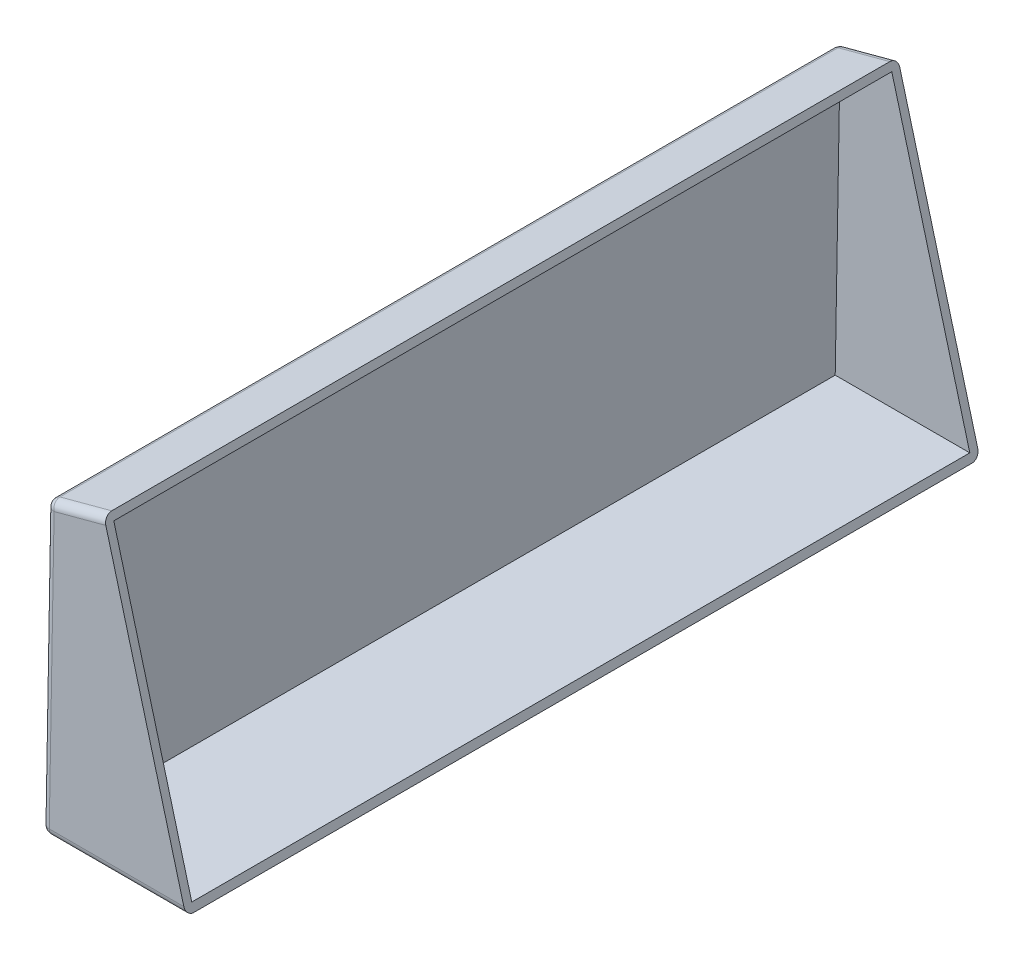
ISO-10303-21;
HEADER;
FILE_DESCRIPTION(('STEP AP214'),'2;1');
FILE_NAME('part.step','',(''),(''),'','','');
FILE_SCHEMA(('AUTOMOTIVE_DESIGN { 1 0 10303 214 1 1 1 1 }'));
ENDSEC;
DATA;
#1=APPLICATION_CONTEXT('core data for automotive mechanical design processes');
#2=APPLICATION_PROTOCOL_DEFINITION('international standard','automotive_design',2000,#1);
#3=PRODUCT_CONTEXT('',#1,'mechanical');
#4=PRODUCT('Part','Part','',(#3));
#5=PRODUCT_RELATED_PRODUCT_CATEGORY('part','',(#4));
#6=PRODUCT_DEFINITION_FORMATION('','',#4);
#7=PRODUCT_DEFINITION_CONTEXT('part definition',#1,'design');
#8=PRODUCT_DEFINITION('design','',#6,#7);
#9=PRODUCT_DEFINITION_SHAPE('','',#8);
#10=(LENGTH_UNIT() NAMED_UNIT(*) SI_UNIT(.MILLI.,.METRE.));
#11=(NAMED_UNIT(*) PLANE_ANGLE_UNIT() SI_UNIT($,.RADIAN.));
#12=(NAMED_UNIT(*) SI_UNIT($,.STERADIAN.) SOLID_ANGLE_UNIT());
#13=UNCERTAINTY_MEASURE_WITH_UNIT(LENGTH_MEASURE(1.E-05),#10,'distance_accuracy_value','');
#14=(GEOMETRIC_REPRESENTATION_CONTEXT(3) GLOBAL_UNCERTAINTY_ASSIGNED_CONTEXT((#13)) GLOBAL_UNIT_ASSIGNED_CONTEXT((#10,
#11,#12)) REPRESENTATION_CONTEXT('',''));
#15=CARTESIAN_POINT('',(0.,0.,0.));
#16=DIRECTION('',(0.,0.,1.));
#17=DIRECTION('',(1.,0.,0.));
#18=AXIS2_PLACEMENT_3D('',#15,#16,#17);
#19=CARTESIAN_POINT('',(-20.705523608202,77.2740661031254,200.));
#20=DIRECTION('',(-0.965925826289067,-0.258819045102525,0.));
#21=DIRECTION('',(0.258819045102525,-0.965925826289067,0.));
#22=AXIS2_PLACEMENT_3D('',#19,#20,#21);
#23=PLANE('',#22);
#24=DIRECTION('',(-0.258819045102525,0.965925826289067,0.));
#25=VECTOR('',#24,1.);
#26=CARTESIAN_POINT('',(-20.705523608202,77.2740661031254,0.));
#27=LINE('',#26,#25);
#28=CARTESIAN_POINT('',(-0.535898384862257,2.,0.));
#29=VERTEX_POINT('',#28);
#30=CARTESIAN_POINT('',(-20.1878855179969,75.3422144505472,0.));
#31=VERTEX_POINT('',#30);
#32=EDGE_CURVE('E179',#29,#31,#27,.T.);
#33=ORIENTED_EDGE('',*,*,#32,.T.);
#34=CARTESIAN_POINT('',(-20.187885517997,75.3422144505472,2.));
#35=DIRECTION('',(-0.965925826289067,-0.258819045102525,0.));
#36=DIRECTION('',(0.258819045102525,-0.965925826289067,0.));
#37=AXIS2_PLACEMENT_3D('',#34,#35,#36);
#38=CIRCLE('',#37,2.);
#39=CARTESIAN_POINT('',(-20.705523608202,77.2740661031254,2.));
#40=VERTEX_POINT('',#39);
#41=EDGE_CURVE('E11',#31,#40,#38,.F.);
#42=ORIENTED_EDGE('',*,*,#41,.T.);
#43=DIRECTION('',(0.,0.,-1.));
#44=VECTOR('',#43,1.);
#45=CARTESIAN_POINT('',(-20.705523608202,77.2740661031254,200.));
#46=LINE('',#45,#44);
#47=CARTESIAN_POINT('',(-20.705523608202,77.2740661031254,198.));
#48=VERTEX_POINT('',#47);
#49=EDGE_CURVE('E184',#48,#40,#46,.T.);
#50=ORIENTED_EDGE('',*,*,#49,.F.);
#51=CARTESIAN_POINT('',(-20.1878855179969,75.3422144505472,198.));
#52=DIRECTION('',(-0.965925826289067,-0.258819045102525,0.));
#53=DIRECTION('',(0.258819045102525,-0.965925826289067,0.));
#54=AXIS2_PLACEMENT_3D('',#51,#52,#53);
#55=CIRCLE('',#54,2.);
#56=CARTESIAN_POINT('',(-20.1878855179969,75.3422144505472,200.));
#57=VERTEX_POINT('',#56);
#58=EDGE_CURVE('E220',#48,#57,#55,.F.);
#59=ORIENTED_EDGE('',*,*,#58,.T.);
#60=DIRECTION('',(-0.258819045102525,0.965925826289067,0.));
#61=VECTOR('',#60,1.);
#62=CARTESIAN_POINT('',(-20.705523608202,77.2740661031254,200.));
#63=LINE('',#62,#61);
#64=CARTESIAN_POINT('',(-0.535898384862257,2.,200.));
#65=VERTEX_POINT('',#64);
#66=EDGE_CURVE('E175',#65,#57,#63,.T.);
#67=ORIENTED_EDGE('',*,*,#66,.F.);
#68=CARTESIAN_POINT('',(-0.535898384862251,2.,198.));
#69=DIRECTION('',(-0.965925826289067,-0.258819045102525,0.));
#70=DIRECTION('',(-0.258819045102525,0.965925826289067,0.));
#71=AXIS2_PLACEMENT_3D('',#68,#69,#70);
#72=ELLIPSE('',#71,2.07055236082017,2.);
#73=CARTESIAN_POINT('',(0.,0.,198.));
#74=VERTEX_POINT('',#73);
#75=EDGE_CURVE('E222',#65,#74,#72,.F.);
#76=ORIENTED_EDGE('',*,*,#75,.T.);
#77=DIRECTION('',(0.,0.,-1.));
#78=VECTOR('',#77,1.);
#79=CARTESIAN_POINT('',(0.,0.,200.));
#80=LINE('',#79,#78);
#81=CARTESIAN_POINT('',(0.,0.,2.));
#82=VERTEX_POINT('',#81);
#83=EDGE_CURVE('E178',#74,#82,#80,.T.);
#84=ORIENTED_EDGE('',*,*,#83,.T.);
#85=CARTESIAN_POINT('',(-0.535898384862251,2.,2.));
#86=DIRECTION('',(-0.965925826289067,-0.258819045102525,0.));
#87=DIRECTION('',(0.258819045102525,-0.965925826289067,0.));
#88=AXIS2_PLACEMENT_3D('',#85,#86,#87);
#89=ELLIPSE('',#88,2.07055236082017,2.);
#90=EDGE_CURVE('E41',#82,#29,#89,.F.);
#91=ORIENTED_EDGE('',*,*,#90,.T.);
#92=EDGE_LOOP('',(#33,#42,#50,#59,#67,#76,#84,#91));
#93=FACE_BOUND('',#92,.T.);
#94=DIRECTION('',(-0.258819045102525,0.965925826289067,0.));
#95=VECTOR('',#94,1.);
#96=CARTESIAN_POINT('',(-20.705523608202,77.2740661031254,2.));
#97=LINE('',#96,#95);
#98=CARTESIAN_POINT('',(-0.535898384862249,2.,2.));
#99=VERTEX_POINT('',#98);
#100=CARTESIAN_POINT('',(-20.1878855179969,75.3422144505472,2.));
#101=VERTEX_POINT('',#100);
#102=EDGE_CURVE('E142',#99,#101,#97,.T.);
#103=ORIENTED_EDGE('',*,*,#102,.F.);
#104=DIRECTION('',(0.,0.,-1.));
#105=VECTOR('',#104,1.);
#106=CARTESIAN_POINT('',(-0.535898384862253,2.,200.));
#107=LINE('',#106,#105);
#108=CARTESIAN_POINT('',(-0.535898384862249,2.,198.));
#109=VERTEX_POINT('',#108);
#110=EDGE_CURVE('E163',#109,#99,#107,.T.);
#111=ORIENTED_EDGE('',*,*,#110,.F.);
#112=DIRECTION('',(-0.258819045102525,0.965925826289067,0.));
#113=VECTOR('',#112,1.);
#114=CARTESIAN_POINT('',(-20.705523608202,77.2740661031254,198.));
#115=LINE('',#114,#113);
#116=CARTESIAN_POINT('',(-20.1878855179969,75.3422144505472,198.));
#117=VERTEX_POINT('',#116);
#118=EDGE_CURVE('E49',#109,#117,#115,.T.);
#119=ORIENTED_EDGE('',*,*,#118,.T.);
#120=DIRECTION('',(0.,0.,-1.));
#121=VECTOR('',#120,1.);
#122=CARTESIAN_POINT('',(-20.187885517997,75.3422144505472,200.));
#123=LINE('',#122,#121);
#124=EDGE_CURVE('E160',#117,#101,#123,.T.);
#125=ORIENTED_EDGE('',*,*,#124,.T.);
#126=EDGE_LOOP('',(#103,#111,#119,#125));
#127=FACE_BOUND('',#126,.T.);
#128=ADVANCED_FACE('F32',(#93,#127),#23,.F.);
#129=CARTESIAN_POINT('',(-35.194411002538,73.3917804265876,200.));
#130=DIRECTION('',(0.258819045102515,-0.96592582628907,0.));
#131=DIRECTION('',(0.96592582628907,0.258819045102515,0.));
#132=AXIS2_PLACEMENT_3D('',#129,#130,#131);
#133=PLANE('',#132);
#134=ORIENTED_EDGE('',*,*,#49,.T.);
#135=DIRECTION('',(-0.96592582628907,-0.258819045102515,0.));
#136=VECTOR('',#135,1.);
#137=CARTESIAN_POINT('',(-35.194411002538,73.3917804265876,2.));
#138=LINE('',#137,#136);
#139=CARTESIAN_POINT('',(-33.73865636554,73.7818487059491,2.));
#140=VERTEX_POINT('',#139);
#141=EDGE_CURVE('E201',#40,#140,#138,.T.);
#142=ORIENTED_EDGE('',*,*,#141,.T.);
#143=DIRECTION('',(0.,0.,-1.));
#144=VECTOR('',#143,1.);
#145=CARTESIAN_POINT('',(-33.73865636554,73.7818487059491,200.));
#146=LINE('',#145,#144);
#147=CARTESIAN_POINT('',(-33.73865636554,73.7818487059491,198.));
#148=VERTEX_POINT('',#147);
#149=EDGE_CURVE('E198',#140,#148,#146,.F.);
#150=ORIENTED_EDGE('',*,*,#149,.T.);
#151=DIRECTION('',(-0.96592582628907,-0.258819045102515,0.));
#152=VECTOR('',#151,1.);
#153=CARTESIAN_POINT('',(-20.705523608202,77.2740661031254,198.));
#154=LINE('',#153,#152);
#155=EDGE_CURVE('E196',#148,#48,#154,.F.);
#156=ORIENTED_EDGE('',*,*,#155,.T.);
#157=EDGE_LOOP('',(#134,#142,#150,#156));
#158=FACE_BOUND('',#157,.T.);
#159=ADVANCED_FACE('F307',(#158),#133,.F.);
#160=CARTESIAN_POINT('',(-36.4754692950819,0.,200.));
#161=DIRECTION('',(0.999847695156391,-0.0174524064372868,0.));
#162=DIRECTION('',(0.0174524064372868,0.999847695156391,0.));
#163=AXIS2_PLACEMENT_3D('',#160,#161,#162);
#164=PLANE('',#163);
#165=DIRECTION('',(-0.0174524064372868,-0.999847695156391,0.));
#166=VECTOR('',#165,1.);
#167=CARTESIAN_POINT('',(-35.194411002538,73.3917804265876,198.));
#168=LINE('',#167,#166);
#169=CARTESIAN_POINT('',(-36.4399498994504,2.03490481287457,198.));
#170=VERTEX_POINT('',#169);
#171=CARTESIAN_POINT('',(-35.2207136656478,71.8849018662455,198.));
#172=VERTEX_POINT('',#171);
#173=EDGE_CURVE('E191',#170,#172,#168,.F.);
#174=ORIENTED_EDGE('',*,*,#173,.T.);
#175=DIRECTION('',(0.,0.,-1.));
#176=VECTOR('',#175,1.);
#177=CARTESIAN_POINT('',(-35.2207136656478,71.8849018662455,200.));
#178=LINE('',#177,#176);
#179=CARTESIAN_POINT('',(-35.2207136656478,71.8849018662455,2.));
#180=VERTEX_POINT('',#179);
#181=EDGE_CURVE('E193',#172,#180,#178,.T.);
#182=ORIENTED_EDGE('',*,*,#181,.T.);
#183=DIRECTION('',(-0.0174524064372868,-0.999847695156391,0.));
#184=VECTOR('',#183,1.);
#185=CARTESIAN_POINT('',(-36.4754692950819,0.,2.));
#186=LINE('',#185,#184);
#187=CARTESIAN_POINT('',(-36.4399498994504,2.03490481287457,2.));
#188=VERTEX_POINT('',#187);
#189=EDGE_CURVE('E187',#180,#188,#186,.T.);
#190=ORIENTED_EDGE('',*,*,#189,.T.);
#191=DIRECTION('',(0.,0.,-1.));
#192=VECTOR('',#191,1.);
#193=CARTESIAN_POINT('',(-36.4399498994504,2.03490481287457,200.));
#194=LINE('',#193,#192);
#195=EDGE_CURVE('E189',#188,#170,#194,.F.);
#196=ORIENTED_EDGE('',*,*,#195,.T.);
#197=EDGE_LOOP('',(#174,#182,#190,#196));
#198=FACE_BOUND('',#197,.T.);
#199=ADVANCED_FACE('F270',(#198),#164,.F.);
#200=CARTESIAN_POINT('',(0.,0.,200.));
#201=DIRECTION('',(0.,1.,0.));
#202=DIRECTION('',(-1.,0.,0.));
#203=AXIS2_PLACEMENT_3D('',#200,#201,#202);
#204=PLANE('',#203);
#205=DIRECTION('',(0.,0.,-1.));
#206=VECTOR('',#205,1.);
#207=CARTESIAN_POINT('',(-34.4402545091376,0.,200.));
#208=LINE('',#207,#206);
#209=CARTESIAN_POINT('',(-34.4402545091376,0.,198.));
#210=VERTEX_POINT('',#209);
#211=CARTESIAN_POINT('',(-34.4402545091376,0.,2.));
#212=VERTEX_POINT('',#211);
#213=EDGE_CURVE('E211',#210,#212,#208,.T.);
#214=ORIENTED_EDGE('',*,*,#213,.T.);
#215=DIRECTION('',(1.,0.,0.));
#216=VECTOR('',#215,1.);
#217=CARTESIAN_POINT('',(0.,0.,2.));
#218=LINE('',#217,#216);
#219=EDGE_CURVE('E213',#212,#82,#218,.T.);
#220=ORIENTED_EDGE('',*,*,#219,.T.);
#221=ORIENTED_EDGE('',*,*,#83,.F.);
#222=DIRECTION('',(1.,0.,0.));
#223=VECTOR('',#222,1.);
#224=CARTESIAN_POINT('',(-36.4754692950819,0.,198.));
#225=LINE('',#224,#223);
#226=EDGE_CURVE('E209',#74,#210,#225,.F.);
#227=ORIENTED_EDGE('',*,*,#226,.T.);
#228=EDGE_LOOP('',(#214,#220,#221,#227));
#229=FACE_BOUND('',#228,.T.);
#230=ADVANCED_FACE('F280',(#229),#204,.F.);
#231=CARTESIAN_POINT('',(0.,0.,200.));
#232=DIRECTION('',(0.,0.,1.));
#233=DIRECTION('',(1.,0.,0.));
#234=AXIS2_PLACEMENT_3D('',#231,#232,#233);
#235=PLANE('',#234);
#236=DIRECTION('',(-0.0174524064372868,-0.999847695156391,0.));
#237=VECTOR('',#236,1.);
#238=CARTESIAN_POINT('',(-34.4757739047691,-0.0349048128745795,200.));
#239=LINE('',#238,#237);
#240=CARTESIAN_POINT('',(-33.221018275335,71.849997053371,200.));
#241=VERTEX_POINT('',#240);
#242=CARTESIAN_POINT('',(-34.4402545091376,1.99999999999999,200.));
#243=VERTEX_POINT('',#242);
#244=EDGE_CURVE('E205',#241,#243,#239,.T.);
#245=ORIENTED_EDGE('',*,*,#244,.T.);
#246=DIRECTION('',(1.,0.,0.));
#247=VECTOR('',#246,1.);
#248=CARTESIAN_POINT('',(0.,2.,200.));
#249=LINE('',#248,#247);
#250=EDGE_CURVE('E207',#243,#65,#249,.T.);
#251=ORIENTED_EDGE('',*,*,#250,.T.);
#252=ORIENTED_EDGE('',*,*,#66,.T.);
#253=DIRECTION('',(-0.96592582628907,-0.258819045102515,0.));
#254=VECTOR('',#253,1.);
#255=CARTESIAN_POINT('',(-34.676772912333,71.4599287740095,200.));
#256=LINE('',#255,#254);
#257=EDGE_CURVE('E203',#57,#241,#256,.T.);
#258=ORIENTED_EDGE('',*,*,#257,.T.);
#259=EDGE_LOOP('',(#245,#251,#252,#258));
#260=FACE_BOUND('',#259,.T.);
#261=ADVANCED_FACE('F316',(#260),#235,.T.);
#262=CARTESIAN_POINT('',(0.,0.,0.));
#263=DIRECTION('',(0.,0.,1.));
#264=DIRECTION('',(1.,0.,0.));
#265=AXIS2_PLACEMENT_3D('',#262,#263,#264);
#266=PLANE('',#265);
#267=DIRECTION('',(-0.0174524064372868,-0.999847695156391,0.));
#268=VECTOR('',#267,1.);
#269=CARTESIAN_POINT('',(-34.4646639695889,0.601582947318489,0.));
#270=LINE('',#269,#268);
#271=CARTESIAN_POINT('',(-34.4402545091376,1.99999999999999,0.));
#272=VERTEX_POINT('',#271);
#273=CARTESIAN_POINT('',(-33.221018275335,71.849997053371,0.));
#274=VERTEX_POINT('',#273);
#275=EDGE_CURVE('E57',#272,#274,#270,.F.);
#276=ORIENTED_EDGE('',*,*,#275,.T.);
#277=DIRECTION('',(-0.96592582628907,-0.258819045102515,0.));
#278=VECTOR('',#277,1.);
#279=CARTESIAN_POINT('',(-20.1878855179962,75.3422144505474,0.));
#280=LINE('',#279,#278);
#281=EDGE_CURVE('E218',#274,#31,#280,.F.);
#282=ORIENTED_EDGE('',*,*,#281,.T.);
#283=ORIENTED_EDGE('',*,*,#32,.F.);
#284=DIRECTION('',(1.,0.,0.));
#285=VECTOR('',#284,1.);
#286=CARTESIAN_POINT('',(0.,2.,0.));
#287=LINE('',#286,#285);
#288=EDGE_CURVE('E215',#29,#272,#287,.F.);
#289=ORIENTED_EDGE('',*,*,#288,.T.);
#290=EDGE_LOOP('',(#276,#282,#283,#289));
#291=FACE_BOUND('',#290,.T.);
#292=ADVANCED_FACE('F292',(#291),#266,.F.);
#293=CARTESIAN_POINT('',(0.,2.,198.));
#294=DIRECTION('',(-1.,0.,0.));
#295=DIRECTION('',(0.,-1.,0.));
#296=AXIS2_PLACEMENT_3D('',#293,#294,#295);
#297=CYLINDRICAL_SURFACE('',#296,2.);
#298=ORIENTED_EDGE('',*,*,#75,.F.);
#299=ORIENTED_EDGE('',*,*,#250,.F.);
#300=CARTESIAN_POINT('',(-34.4402545091376,1.99999999999999,198.));
#301=DIRECTION('',(-1.,0.,0.));
#302=DIRECTION('',(0.,0.,1.));
#303=AXIS2_PLACEMENT_3D('',#300,#301,#302);
#304=CIRCLE('',#303,2.);
#305=EDGE_CURVE('E36',#210,#243,#304,.T.);
#306=ORIENTED_EDGE('',*,*,#305,.F.);
#307=ORIENTED_EDGE('',*,*,#226,.F.);
#308=EDGE_LOOP('',(#298,#299,#306,#307));
#309=FACE_BOUND('',#308,.T.);
#310=ADVANCED_FACE('F34',(#309),#297,.T.);
#311=CARTESIAN_POINT('',(-34.4402545091376,1.99999999999999,200.));
#312=DIRECTION('',(0.,0.,-1.));
#313=DIRECTION('',(-1.,0.,0.));
#314=AXIS2_PLACEMENT_3D('',#311,#312,#313);
#315=CYLINDRICAL_SURFACE('',#314,2.);
#316=CARTESIAN_POINT('',(-34.4402545091376,1.99999999999999,2.));
#317=DIRECTION('',(0.,0.,-1.));
#318=DIRECTION('',(-1.,0.,0.));
#319=AXIS2_PLACEMENT_3D('',#316,#317,#318);
#320=CIRCLE('',#319,2.);
#321=EDGE_CURVE('E249',#212,#188,#320,.T.);
#322=ORIENTED_EDGE('',*,*,#321,.F.);
#323=ORIENTED_EDGE('',*,*,#213,.F.);
#324=CARTESIAN_POINT('',(-34.4402545091376,1.99999999999999,198.));
#325=DIRECTION('',(0.,0.,1.));
#326=DIRECTION('',(1.,0.,0.));
#327=AXIS2_PLACEMENT_3D('',#324,#325,#326);
#328=CIRCLE('',#327,2.);
#329=EDGE_CURVE('E251',#170,#210,#328,.T.);
#330=ORIENTED_EDGE('',*,*,#329,.F.);
#331=ORIENTED_EDGE('',*,*,#195,.F.);
#332=EDGE_LOOP('',(#322,#323,#330,#331));
#333=FACE_BOUND('',#332,.T.);
#334=ADVANCED_FACE('F277',(#333),#315,.T.);
#335=CARTESIAN_POINT('',(0.,2.,2.));
#336=DIRECTION('',(1.,0.,0.));
#337=DIRECTION('',(0.,1.,0.));
#338=AXIS2_PLACEMENT_3D('',#335,#336,#337);
#339=CYLINDRICAL_SURFACE('',#338,2.);
#340=ORIENTED_EDGE('',*,*,#90,.F.);
#341=ORIENTED_EDGE('',*,*,#219,.F.);
#342=CARTESIAN_POINT('',(-34.4402545091376,1.99999999999999,2.));
#343=DIRECTION('',(-1.,0.,0.));
#344=DIRECTION('',(0.,0.,1.));
#345=AXIS2_PLACEMENT_3D('',#342,#343,#344);
#346=CIRCLE('',#345,2.);
#347=EDGE_CURVE('E246',#272,#212,#346,.T.);
#348=ORIENTED_EDGE('',*,*,#347,.F.);
#349=ORIENTED_EDGE('',*,*,#288,.F.);
#350=EDGE_LOOP('',(#340,#341,#348,#349));
#351=FACE_BOUND('',#350,.T.);
#352=ADVANCED_FACE('F285',(#351),#339,.T.);
#353=CARTESIAN_POINT('',(-34.4402545091376,1.99999999999999,198.));
#354=DIRECTION('',(0.,0.,1.));
#355=DIRECTION('',(1.,0.,0.));
#356=AXIS2_PLACEMENT_3D('',#353,#354,#355);
#357=SPHERICAL_SURFACE('',#356,2.);
#358=ORIENTED_EDGE('',*,*,#329,.T.);
#359=ORIENTED_EDGE('',*,*,#305,.T.);
#360=CARTESIAN_POINT('',(-34.4402545091376,1.99999999999999,198.));
#361=DIRECTION('',(-0.0174524064372868,-0.999847695156391,0.));
#362=DIRECTION('',(0.999847695156391,-0.0174524064372868,0.));
#363=AXIS2_PLACEMENT_3D('',#360,#361,#362);
#364=CIRCLE('',#363,2.);
#365=EDGE_CURVE('E243',#170,#243,#364,.F.);
#366=ORIENTED_EDGE('',*,*,#365,.F.);
#367=EDGE_LOOP('',(#358,#359,#366));
#368=FACE_BOUND('',#367,.T.);
#369=ADVANCED_FACE('F258',(#368),#357,.T.);
#370=CARTESIAN_POINT('',(-34.4402545091376,1.99999999999999,2.));
#371=DIRECTION('',(0.,0.,1.));
#372=DIRECTION('',(1.,0.,0.));
#373=AXIS2_PLACEMENT_3D('',#370,#371,#372);
#374=SPHERICAL_SURFACE('',#373,2.);
#375=ORIENTED_EDGE('',*,*,#347,.T.);
#376=ORIENTED_EDGE('',*,*,#321,.T.);
#377=CARTESIAN_POINT('',(-34.4402545091376,1.99999999999999,2.));
#378=DIRECTION('',(-0.0174524064372868,-0.999847695156391,0.));
#379=DIRECTION('',(0.999847695156391,-0.0174524064372868,0.));
#380=AXIS2_PLACEMENT_3D('',#377,#378,#379);
#381=CIRCLE('',#380,2.);
#382=EDGE_CURVE('E240',#272,#188,#381,.F.);
#383=ORIENTED_EDGE('',*,*,#382,.F.);
#384=EDGE_LOOP('',(#375,#376,#383));
#385=FACE_BOUND('',#384,.T.);
#386=ADVANCED_FACE('F348',(#385),#374,.T.);
#387=CARTESIAN_POINT('',(-20.1878855179962,75.3422144505474,198.));
#388=DIRECTION('',(0.96592582628907,0.258819045102515,0.));
#389=DIRECTION('',(-0.258819045102515,0.96592582628907,0.));
#390=AXIS2_PLACEMENT_3D('',#387,#388,#389);
#391=CYLINDRICAL_SURFACE('',#390,2.);
#392=ORIENTED_EDGE('',*,*,#58,.F.);
#393=ORIENTED_EDGE('',*,*,#155,.F.);
#394=CARTESIAN_POINT('',(-33.221018275335,71.849997053371,198.));
#395=DIRECTION('',(-0.965925826289068,-0.25881904510252,0.));
#396=DIRECTION('',(0.25881904510252,-0.965925826289068,0.));
#397=AXIS2_PLACEMENT_3D('',#394,#395,#396);
#398=CIRCLE('',#397,2.);
#399=EDGE_CURVE('E237',#241,#148,#398,.T.);
#400=ORIENTED_EDGE('',*,*,#399,.F.);
#401=ORIENTED_EDGE('',*,*,#257,.F.);
#402=EDGE_LOOP('',(#392,#393,#400,#401));
#403=FACE_BOUND('',#402,.T.);
#404=ADVANCED_FACE('F314',(#403),#391,.T.);
#405=CARTESIAN_POINT('',(-34.4646639695889,0.601582947318489,198.));
#406=DIRECTION('',(0.0174524064372868,0.999847695156391,0.));
#407=DIRECTION('',(-0.999847695156391,0.0174524064372868,0.));
#408=AXIS2_PLACEMENT_3D('',#405,#406,#407);
#409=CYLINDRICAL_SURFACE('',#408,2.);
#410=ORIENTED_EDGE('',*,*,#365,.T.);
#411=ORIENTED_EDGE('',*,*,#244,.F.);
#412=CARTESIAN_POINT('',(-33.221018275335,71.849997053371,198.));
#413=DIRECTION('',(0.0174524064372877,0.999847695156391,0.));
#414=DIRECTION('',(-0.999847695156391,0.0174524064372877,0.));
#415=AXIS2_PLACEMENT_3D('',#412,#413,#414);
#416=CIRCLE('',#415,2.);
#417=EDGE_CURVE('E234',#172,#241,#416,.T.);
#418=ORIENTED_EDGE('',*,*,#417,.F.);
#419=ORIENTED_EDGE('',*,*,#173,.F.);
#420=EDGE_LOOP('',(#410,#411,#418,#419));
#421=FACE_BOUND('',#420,.T.);
#422=ADVANCED_FACE('F265',(#421),#409,.T.);
#423=CARTESIAN_POINT('',(-34.4757739047691,-0.0349048128745793,2.));
#424=DIRECTION('',(-0.0174524064372868,-0.999847695156391,0.));
#425=DIRECTION('',(0.999847695156391,-0.0174524064372868,0.));
#426=AXIS2_PLACEMENT_3D('',#423,#424,#425);
#427=CYLINDRICAL_SURFACE('',#426,2.);
#428=ORIENTED_EDGE('',*,*,#382,.T.);
#429=ORIENTED_EDGE('',*,*,#189,.F.);
#430=CARTESIAN_POINT('',(-33.221018275335,71.849997053371,2.));
#431=DIRECTION('',(0.0174524064372808,0.999847695156391,0.));
#432=DIRECTION('',(-0.999847695156391,0.0174524064372808,0.));
#433=AXIS2_PLACEMENT_3D('',#430,#431,#432);
#434=CIRCLE('',#433,2.);
#435=EDGE_CURVE('E231',#274,#180,#434,.T.);
#436=ORIENTED_EDGE('',*,*,#435,.F.);
#437=ORIENTED_EDGE('',*,*,#275,.F.);
#438=EDGE_LOOP('',(#428,#429,#436,#437));
#439=FACE_BOUND('',#438,.T.);
#440=ADVANCED_FACE('F300',(#439),#427,.T.);
#441=CARTESIAN_POINT('',(-34.676772912333,71.4599287740095,2.));
#442=DIRECTION('',(-0.96592582628907,-0.258819045102515,0.));
#443=DIRECTION('',(0.258819045102515,-0.96592582628907,0.));
#444=AXIS2_PLACEMENT_3D('',#441,#442,#443);
#445=CYLINDRICAL_SURFACE('',#444,2.);
#446=ORIENTED_EDGE('',*,*,#41,.F.);
#447=ORIENTED_EDGE('',*,*,#281,.F.);
#448=CARTESIAN_POINT('',(-33.221018275335,71.849997053371,2.));
#449=DIRECTION('',(-0.96592582628907,-0.258819045102515,0.));
#450=DIRECTION('',(0.258819045102515,-0.96592582628907,0.));
#451=AXIS2_PLACEMENT_3D('',#448,#449,#450);
#452=CIRCLE('',#451,2.);
#453=EDGE_CURVE('E228',#140,#274,#452,.T.);
#454=ORIENTED_EDGE('',*,*,#453,.F.);
#455=ORIENTED_EDGE('',*,*,#141,.F.);
#456=EDGE_LOOP('',(#446,#447,#454,#455));
#457=FACE_BOUND('',#456,.T.);
#458=ADVANCED_FACE('F296',(#457),#445,.T.);
#459=CARTESIAN_POINT('',(-33.221018275335,71.849997053371,198.));
#460=DIRECTION('',(0.,0.,1.));
#461=DIRECTION('',(1.,0.,0.));
#462=AXIS2_PLACEMENT_3D('',#459,#460,#461);
#463=SPHERICAL_SURFACE('',#462,2.);
#464=ORIENTED_EDGE('',*,*,#417,.T.);
#465=ORIENTED_EDGE('',*,*,#399,.T.);
#466=CARTESIAN_POINT('',(-33.221018275335,71.849997053371,198.));
#467=DIRECTION('',(0.,0.,1.));
#468=DIRECTION('',(1.,0.,0.));
#469=AXIS2_PLACEMENT_3D('',#466,#467,#468);
#470=CIRCLE('',#469,2.);
#471=EDGE_CURVE('E226',#172,#148,#470,.F.);
#472=ORIENTED_EDGE('',*,*,#471,.F.);
#473=EDGE_LOOP('',(#464,#465,#472));
#474=FACE_BOUND('',#473,.T.);
#475=ADVANCED_FACE('F336',(#474),#463,.T.);
#476=CARTESIAN_POINT('',(-33.221018275335,71.849997053371,2.));
#477=DIRECTION('',(0.,0.,1.));
#478=DIRECTION('',(1.,0.,0.));
#479=AXIS2_PLACEMENT_3D('',#476,#477,#478);
#480=SPHERICAL_SURFACE('',#479,2.);
#481=ORIENTED_EDGE('',*,*,#453,.T.);
#482=ORIENTED_EDGE('',*,*,#435,.T.);
#483=CARTESIAN_POINT('',(-33.221018275335,71.849997053371,2.));
#484=DIRECTION('',(0.,0.,-1.));
#485=DIRECTION('',(-1.,0.,0.));
#486=AXIS2_PLACEMENT_3D('',#483,#484,#485);
#487=CIRCLE('',#486,2.);
#488=EDGE_CURVE('E146',#140,#180,#487,.F.);
#489=ORIENTED_EDGE('',*,*,#488,.F.);
#490=EDGE_LOOP('',(#481,#482,#489));
#491=FACE_BOUND('',#490,.T.);
#492=ADVANCED_FACE('F303',(#491),#480,.T.);
#493=CARTESIAN_POINT('',(-33.221018275335,71.849997053371,200.));
#494=DIRECTION('',(0.,0.,-1.));
#495=DIRECTION('',(-1.,0.,0.));
#496=AXIS2_PLACEMENT_3D('',#493,#494,#495);
#497=CYLINDRICAL_SURFACE('',#496,2.);
#498=ORIENTED_EDGE('',*,*,#471,.T.);
#499=ORIENTED_EDGE('',*,*,#149,.F.);
#500=ORIENTED_EDGE('',*,*,#488,.T.);
#501=ORIENTED_EDGE('',*,*,#181,.F.);
#502=EDGE_LOOP('',(#498,#499,#500,#501));
#503=FACE_BOUND('',#502,.T.);
#504=ADVANCED_FACE('F305',(#503),#497,.T.);
#505=CARTESIAN_POINT('',(-34.676772912333,71.4599287740095,200.));
#506=DIRECTION('',(0.258819045102515,-0.96592582628907,0.));
#507=DIRECTION('',(0.96592582628907,0.258819045102515,0.));
#508=AXIS2_PLACEMENT_3D('',#505,#506,#507);
#509=PLANE('',#508);
#510=ORIENTED_EDGE('',*,*,#124,.F.);
#511=DIRECTION('',(0.96592582628907,0.258819045102515,0.));
#512=VECTOR('',#511,1.);
#513=CARTESIAN_POINT('',(-20.1878855179962,75.3422144505474,198.));
#514=LINE('',#513,#512);
#515=CARTESIAN_POINT('',(-33.221018275335,71.849997053371,198.));
#516=VERTEX_POINT('',#515);
#517=EDGE_CURVE('E153',#516,#117,#514,.T.);
#518=ORIENTED_EDGE('',*,*,#517,.F.);
#519=DIRECTION('',(0.,0.,1.));
#520=VECTOR('',#519,1.);
#521=CARTESIAN_POINT('',(-33.221018275335,71.849997053371,200.));
#522=LINE('',#521,#520);
#523=CARTESIAN_POINT('',(-33.221018275335,71.849997053371,2.));
#524=VERTEX_POINT('',#523);
#525=EDGE_CURVE('E151',#524,#516,#522,.T.);
#526=ORIENTED_EDGE('',*,*,#525,.F.);
#527=DIRECTION('',(0.96592582628907,0.258819045102515,0.));
#528=VECTOR('',#527,1.);
#529=CARTESIAN_POINT('',(-20.1878855179962,75.3422144505474,2.));
#530=LINE('',#529,#528);
#531=EDGE_CURVE('E135',#524,#101,#530,.T.);
#532=ORIENTED_EDGE('',*,*,#531,.T.);
#533=EDGE_LOOP('',(#510,#518,#526,#532));
#534=FACE_BOUND('',#533,.T.);
#535=ADVANCED_FACE('F152',(#534),#509,.T.);
#536=CARTESIAN_POINT('',(-34.4757739047691,-0.0349048128745793,200.));
#537=DIRECTION('',(0.999847695156391,-0.0174524064372868,0.));
#538=DIRECTION('',(0.0174524064372868,0.999847695156391,0.));
#539=AXIS2_PLACEMENT_3D('',#536,#537,#538);
#540=PLANE('',#539);
#541=DIRECTION('',(-0.0174524064372868,-0.999847695156391,0.));
#542=VECTOR('',#541,1.);
#543=CARTESIAN_POINT('',(-34.4757739047691,-0.0349048128745793,198.));
#544=LINE('',#543,#542);
#545=CARTESIAN_POINT('',(-34.4402545091376,1.99999999999999,198.));
#546=VERTEX_POINT('',#545);
#547=EDGE_CURVE('E156',#516,#546,#544,.T.);
#548=ORIENTED_EDGE('',*,*,#547,.T.);
#549=DIRECTION('',(0.,0.,-1.));
#550=VECTOR('',#549,1.);
#551=CARTESIAN_POINT('',(-34.4402545091376,1.99999999999999,200.));
#552=LINE('',#551,#550);
#553=CARTESIAN_POINT('',(-34.4402545091376,1.99999999999999,2.));
#554=VERTEX_POINT('',#553);
#555=EDGE_CURVE('E159',#546,#554,#552,.T.);
#556=ORIENTED_EDGE('',*,*,#555,.T.);
#557=DIRECTION('',(-0.0174524064372868,-0.999847695156391,0.));
#558=VECTOR('',#557,1.);
#559=CARTESIAN_POINT('',(-34.4757739047691,-0.0349048128745793,2.));
#560=LINE('',#559,#558);
#561=EDGE_CURVE('E139',#524,#554,#560,.T.);
#562=ORIENTED_EDGE('',*,*,#561,.F.);
#563=ORIENTED_EDGE('',*,*,#525,.T.);
#564=EDGE_LOOP('',(#548,#556,#562,#563));
#565=FACE_BOUND('',#564,.T.);
#566=ADVANCED_FACE('F158',(#565),#540,.T.);
#567=CARTESIAN_POINT('',(0.,2.,200.));
#568=DIRECTION('',(0.,1.,0.));
#569=DIRECTION('',(-1.,0.,0.));
#570=AXIS2_PLACEMENT_3D('',#567,#568,#569);
#571=PLANE('',#570);
#572=ORIENTED_EDGE('',*,*,#555,.F.);
#573=DIRECTION('',(1.,0.,0.));
#574=VECTOR('',#573,1.);
#575=CARTESIAN_POINT('',(0.,2.,198.));
#576=LINE('',#575,#574);
#577=EDGE_CURVE('E168',#546,#109,#576,.T.);
#578=ORIENTED_EDGE('',*,*,#577,.T.);
#579=ORIENTED_EDGE('',*,*,#110,.T.);
#580=DIRECTION('',(1.,0.,0.));
#581=VECTOR('',#580,1.);
#582=CARTESIAN_POINT('',(0.,2.,2.));
#583=LINE('',#582,#581);
#584=EDGE_CURVE('E147',#554,#99,#583,.T.);
#585=ORIENTED_EDGE('',*,*,#584,.F.);
#586=EDGE_LOOP('',(#572,#578,#579,#585));
#587=FACE_BOUND('',#586,.T.);
#588=ADVANCED_FACE('F407',(#587),#571,.T.);
#589=CARTESIAN_POINT('',(0.,0.,198.));
#590=DIRECTION('',(0.,0.,1.));
#591=DIRECTION('',(1.,0.,0.));
#592=AXIS2_PLACEMENT_3D('',#589,#590,#591);
#593=PLANE('',#592);
#594=ORIENTED_EDGE('',*,*,#547,.F.);
#595=ORIENTED_EDGE('',*,*,#517,.T.);
#596=ORIENTED_EDGE('',*,*,#118,.F.);
#597=ORIENTED_EDGE('',*,*,#577,.F.);
#598=EDGE_LOOP('',(#594,#595,#596,#597));
#599=FACE_BOUND('',#598,.T.);
#600=ADVANCED_FACE('F414',(#599),#593,.F.);
#601=CARTESIAN_POINT('',(0.,0.,2.));
#602=DIRECTION('',(0.,0.,1.));
#603=DIRECTION('',(1.,0.,0.));
#604=AXIS2_PLACEMENT_3D('',#601,#602,#603);
#605=PLANE('',#604);
#606=ORIENTED_EDGE('',*,*,#561,.T.);
#607=ORIENTED_EDGE('',*,*,#584,.T.);
#608=ORIENTED_EDGE('',*,*,#102,.T.);
#609=ORIENTED_EDGE('',*,*,#531,.F.);
#610=EDGE_LOOP('',(#606,#607,#608,#609));
#611=FACE_BOUND('',#610,.T.);
#612=ADVANCED_FACE('F137',(#611),#605,.T.);
#613=CLOSED_SHELL('',(#128,#159,#199,#230,#261,#292,#310,#334,#352,#369,#386,#404,#422,#440,
#458,#475,#492,#504,#535,#566,#588,#600,#612));
#614=MANIFOLD_SOLID_BREP('B2',#613);
#615=ADVANCED_BREP_SHAPE_REPRESENTATION('',(#18,#614),#14);
#616=SHAPE_DEFINITION_REPRESENTATION(#9,#615);
ENDSEC;
END-ISO-10303-21;
